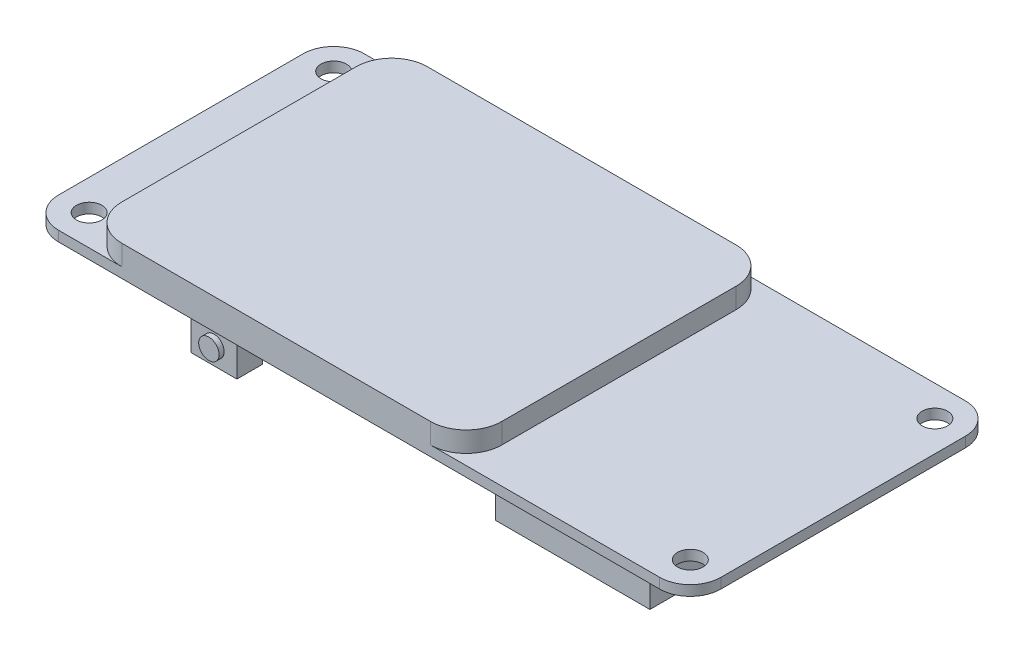
ISO-10303-21;
HEADER;
FILE_DESCRIPTION(('STEP AP214'),'2;1');
FILE_NAME('part.step','',(''),(''),'','','');
FILE_SCHEMA(('AUTOMOTIVE_DESIGN { 1 0 10303 214 1 1 1 1 }'));
ENDSEC;
DATA;
#1=APPLICATION_CONTEXT('core data for automotive mechanical design processes');
#2=APPLICATION_PROTOCOL_DEFINITION('international standard','automotive_design',2000,#1);
#3=PRODUCT_CONTEXT('',#1,'mechanical');
#4=PRODUCT('Part','Part','',(#3));
#5=PRODUCT_RELATED_PRODUCT_CATEGORY('part','',(#4));
#6=PRODUCT_DEFINITION_FORMATION('','',#4);
#7=PRODUCT_DEFINITION_CONTEXT('part definition',#1,'design');
#8=PRODUCT_DEFINITION('design','',#6,#7);
#9=PRODUCT_DEFINITION_SHAPE('','',#8);
#10=(LENGTH_UNIT() NAMED_UNIT(*) SI_UNIT(.MILLI.,.METRE.));
#11=(NAMED_UNIT(*) PLANE_ANGLE_UNIT() SI_UNIT($,.RADIAN.));
#12=(NAMED_UNIT(*) SI_UNIT($,.STERADIAN.) SOLID_ANGLE_UNIT());
#13=UNCERTAINTY_MEASURE_WITH_UNIT(LENGTH_MEASURE(1.E-05),#10,'distance_accuracy_value','');
#14=(GEOMETRIC_REPRESENTATION_CONTEXT(3) GLOBAL_UNCERTAINTY_ASSIGNED_CONTEXT((#13)) GLOBAL_UNIT_ASSIGNED_CONTEXT((#10,
#11,#12)) REPRESENTATION_CONTEXT('',''));
#15=CARTESIAN_POINT('',(0.,0.,0.));
#16=DIRECTION('',(0.,0.,1.));
#17=DIRECTION('',(1.,0.,0.));
#18=AXIS2_PLACEMENT_3D('',#15,#16,#17);
#19=CARTESIAN_POINT('',(29.5,0.,12.));
#20=DIRECTION('',(0.,1.,0.));
#21=DIRECTION('',(0.,0.,1.));
#22=AXIS2_PLACEMENT_3D('',#19,#20,#21);
#23=PLANE('',#22);
#24=DIRECTION('',(0.,0.,-1.));
#25=VECTOR('',#24,1.);
#26=CARTESIAN_POINT('',(10.61,0.,12.216190628889));
#27=LINE('',#26,#25);
#28=CARTESIAN_POINT('',(10.61,0.,12.216190628889));
#29=VERTEX_POINT('',#28);
#30=CARTESIAN_POINT('',(10.61,0.,-7.78380937111097));
#31=VERTEX_POINT('',#30);
#32=EDGE_CURVE('E245',#29,#31,#27,.T.);
#33=ORIENTED_EDGE('',*,*,#32,.F.);
#34=DIRECTION('',(-1.,0.,0.));
#35=VECTOR('',#34,1.);
#36=CARTESIAN_POINT('',(10.61,0.,12.216190628889));
#37=LINE('',#36,#35);
#38=CARTESIAN_POINT('',(25.75,0.,12.216190628889));
#39=VERTEX_POINT('',#38);
#40=EDGE_CURVE('E258',#39,#29,#37,.T.);
#41=ORIENTED_EDGE('',*,*,#40,.F.);
#42=DIRECTION('',(0.,0.,1.));
#43=VECTOR('',#42,1.);
#44=CARTESIAN_POINT('',(25.75,0.,12.216190628889));
#45=LINE('',#44,#43);
#46=CARTESIAN_POINT('',(25.75,0.,-7.78380937111097));
#47=VERTEX_POINT('',#46);
#48=EDGE_CURVE('E267',#47,#39,#45,.T.);
#49=ORIENTED_EDGE('',*,*,#48,.F.);
#50=DIRECTION('',(1.,0.,0.));
#51=VECTOR('',#50,1.);
#52=CARTESIAN_POINT('',(10.61,0.,-7.78380937111097));
#53=LINE('',#52,#51);
#54=EDGE_CURVE('E248',#31,#47,#53,.T.);
#55=ORIENTED_EDGE('',*,*,#54,.F.);
#56=EDGE_LOOP('',(#33,#41,#49,#55));
#57=FACE_BOUND('',#56,.T.);
#58=CARTESIAN_POINT('',(29.5,0.,12.));
#59=DIRECTION('',(0.,1.,0.));
#60=DIRECTION('',(0.,0.,1.));
#61=AXIS2_PLACEMENT_3D('',#58,#59,#60);
#62=CIRCLE('',#61,1.25);
#63=CARTESIAN_POINT('',(29.5,0.,13.25));
#64=VERTEX_POINT('',#63);
#65=EDGE_CURVE('E330',#64,#64,#62,.T.);
#66=ORIENTED_EDGE('',*,*,#65,.T.);
#67=EDGE_LOOP('',(#66));
#68=FACE_BOUND('',#67,.T.);
#69=CARTESIAN_POINT('',(-29.5,0.,12.));
#70=DIRECTION('',(0.,1.,0.));
#71=DIRECTION('',(0.,0.,1.));
#72=AXIS2_PLACEMENT_3D('',#69,#70,#71);
#73=CIRCLE('',#72,1.25);
#74=CARTESIAN_POINT('',(-29.5,0.,13.25));
#75=VERTEX_POINT('',#74);
#76=EDGE_CURVE('E338',#75,#75,#73,.T.);
#77=ORIENTED_EDGE('',*,*,#76,.T.);
#78=EDGE_LOOP('',(#77));
#79=FACE_BOUND('',#78,.T.);
#80=CARTESIAN_POINT('',(29.5,0.,-12.));
#81=DIRECTION('',(0.,1.,0.));
#82=DIRECTION('',(0.,0.,1.));
#83=AXIS2_PLACEMENT_3D('',#80,#81,#82);
#84=CIRCLE('',#83,1.25);
#85=CARTESIAN_POINT('',(29.5,0.,-10.75));
#86=VERTEX_POINT('',#85);
#87=EDGE_CURVE('E344',#86,#86,#84,.T.);
#88=ORIENTED_EDGE('',*,*,#87,.T.);
#89=EDGE_LOOP('',(#88));
#90=FACE_BOUND('',#89,.T.);
#91=CARTESIAN_POINT('',(-29.5,0.,-12.));
#92=DIRECTION('',(0.,1.,0.));
#93=DIRECTION('',(0.,0.,1.));
#94=AXIS2_PLACEMENT_3D('',#91,#92,#93);
#95=CIRCLE('',#94,1.25);
#96=CARTESIAN_POINT('',(-29.5,0.,-10.75));
#97=VERTEX_POINT('',#96);
#98=EDGE_CURVE('E350',#97,#97,#95,.T.);
#99=ORIENTED_EDGE('',*,*,#98,.T.);
#100=EDGE_LOOP('',(#99));
#101=FACE_BOUND('',#100,.T.);
#102=CARTESIAN_POINT('',(29.5,0.,12.));
#103=DIRECTION('',(0.,1.,0.));
#104=DIRECTION('',(0.,0.,1.));
#105=AXIS2_PLACEMENT_3D('',#102,#103,#104);
#106=CIRCLE('',#105,3.);
#107=CARTESIAN_POINT('',(29.5,0.,15.));
#108=VERTEX_POINT('',#107);
#109=CARTESIAN_POINT('',(32.5,0.,12.));
#110=VERTEX_POINT('',#109);
#111=EDGE_CURVE('E356',#108,#110,#106,.T.);
#112=ORIENTED_EDGE('',*,*,#111,.F.);
#113=DIRECTION('',(1.,0.,0.));
#114=VECTOR('',#113,1.);
#115=CARTESIAN_POINT('',(-29.5,0.,15.));
#116=LINE('',#115,#114);
#117=CARTESIAN_POINT('',(-29.5,0.,15.));
#118=VERTEX_POINT('',#117);
#119=EDGE_CURVE('E363',#118,#108,#116,.T.);
#120=ORIENTED_EDGE('',*,*,#119,.F.);
#121=CARTESIAN_POINT('',(-29.5,0.,12.));
#122=DIRECTION('',(0.,1.,0.));
#123=DIRECTION('',(0.,0.,1.));
#124=AXIS2_PLACEMENT_3D('',#121,#122,#123);
#125=CIRCLE('',#124,3.);
#126=CARTESIAN_POINT('',(-32.5,0.,12.));
#127=VERTEX_POINT('',#126);
#128=EDGE_CURVE('E392',#127,#118,#125,.T.);
#129=ORIENTED_EDGE('',*,*,#128,.F.);
#130=DIRECTION('',(0.,0.,1.));
#131=VECTOR('',#130,1.);
#132=CARTESIAN_POINT('',(-32.5,0.,-12.));
#133=LINE('',#132,#131);
#134=CARTESIAN_POINT('',(-32.5,0.,-12.));
#135=VERTEX_POINT('',#134);
#136=EDGE_CURVE('E390',#135,#127,#133,.T.);
#137=ORIENTED_EDGE('',*,*,#136,.F.);
#138=CARTESIAN_POINT('',(-29.5,0.,-12.));
#139=DIRECTION('',(0.,1.,0.));
#140=DIRECTION('',(0.,0.,1.));
#141=AXIS2_PLACEMENT_3D('',#138,#139,#140);
#142=CIRCLE('',#141,3.);
#143=CARTESIAN_POINT('',(-29.5,0.,-15.));
#144=VERTEX_POINT('',#143);
#145=EDGE_CURVE('E388',#144,#135,#142,.T.);
#146=ORIENTED_EDGE('',*,*,#145,.F.);
#147=DIRECTION('',(-1.,0.,0.));
#148=VECTOR('',#147,1.);
#149=CARTESIAN_POINT('',(-29.5,0.,-15.));
#150=LINE('',#149,#148);
#151=CARTESIAN_POINT('',(29.5,0.,-15.));
#152=VERTEX_POINT('',#151);
#153=EDGE_CURVE('E386',#152,#144,#150,.T.);
#154=ORIENTED_EDGE('',*,*,#153,.F.);
#155=CARTESIAN_POINT('',(29.5,0.,-12.));
#156=DIRECTION('',(0.,1.,0.));
#157=DIRECTION('',(0.,0.,-1.));
#158=AXIS2_PLACEMENT_3D('',#155,#156,#157);
#159=CIRCLE('',#158,3.);
#160=CARTESIAN_POINT('',(32.5,0.,-12.));
#161=VERTEX_POINT('',#160);
#162=EDGE_CURVE('E384',#161,#152,#159,.T.);
#163=ORIENTED_EDGE('',*,*,#162,.F.);
#164=DIRECTION('',(0.,0.,-1.));
#165=VECTOR('',#164,1.);
#166=CARTESIAN_POINT('',(32.5,0.,-12.));
#167=LINE('',#166,#165);
#168=EDGE_CURVE('E382',#110,#161,#167,.T.);
#169=ORIENTED_EDGE('',*,*,#168,.F.);
#170=EDGE_LOOP('',(#112,#120,#129,#137,#146,#154,#163,#169));
#171=FACE_BOUND('',#170,.T.);
#172=DIRECTION('',(0.,0.,-1.));
#173=VECTOR('',#172,1.);
#174=CARTESIAN_POINT('',(-25.5,0.,-9.));
#175=LINE('',#174,#173);
#176=CARTESIAN_POINT('',(-25.5,0.,-9.));
#177=VERTEX_POINT('',#176);
#178=CARTESIAN_POINT('',(-25.5,0.,-14.));
#179=VERTEX_POINT('',#178);
#180=EDGE_CURVE('E283',#177,#179,#175,.T.);
#181=ORIENTED_EDGE('',*,*,#180,.F.);
#182=DIRECTION('',(-1.,0.,0.));
#183=VECTOR('',#182,1.);
#184=CARTESIAN_POINT('',(-25.5,0.,-9.));
#185=LINE('',#184,#183);
#186=CARTESIAN_POINT('',(25.5,0.,-9.));
#187=VERTEX_POINT('',#186);
#188=EDGE_CURVE('E288',#187,#177,#185,.T.);
#189=ORIENTED_EDGE('',*,*,#188,.F.);
#190=DIRECTION('',(0.,0.,1.));
#191=VECTOR('',#190,1.);
#192=CARTESIAN_POINT('',(25.5,0.,-9.));
#193=LINE('',#192,#191);
#194=CARTESIAN_POINT('',(25.5,0.,-14.));
#195=VERTEX_POINT('',#194);
#196=EDGE_CURVE('E300',#195,#187,#193,.T.);
#197=ORIENTED_EDGE('',*,*,#196,.F.);
#198=DIRECTION('',(1.,0.,0.));
#199=VECTOR('',#198,1.);
#200=CARTESIAN_POINT('',(-25.5,0.,-14.));
#201=LINE('',#200,#199);
#202=EDGE_CURVE('E297',#179,#195,#201,.T.);
#203=ORIENTED_EDGE('',*,*,#202,.F.);
#204=EDGE_LOOP('',(#181,#189,#197,#203));
#205=FACE_BOUND('',#204,.T.);
#206=DIRECTION('',(0.,0.,-1.));
#207=VECTOR('',#206,1.);
#208=CARTESIAN_POINT('',(-17.,0.,14.5));
#209=LINE('',#208,#207);
#210=CARTESIAN_POINT('',(-17.,0.,14.5));
#211=VERTEX_POINT('',#210);
#212=CARTESIAN_POINT('',(-17.,0.,12.));
#213=VERTEX_POINT('',#212);
#214=EDGE_CURVE('E244',#211,#213,#209,.T.);
#215=ORIENTED_EDGE('',*,*,#214,.F.);
#216=DIRECTION('',(-1.,0.,0.));
#217=VECTOR('',#216,1.);
#218=CARTESIAN_POINT('',(-17.,0.,14.5));
#219=LINE('',#218,#217);
#220=CARTESIAN_POINT('',(-12.5,0.,14.5));
#221=VERTEX_POINT('',#220);
#222=EDGE_CURVE('E241',#221,#211,#219,.T.);
#223=ORIENTED_EDGE('',*,*,#222,.F.);
#224=DIRECTION('',(0.,0.,1.));
#225=VECTOR('',#224,1.);
#226=CARTESIAN_POINT('',(-12.5,0.,14.5));
#227=LINE('',#226,#225);
#228=CARTESIAN_POINT('',(-12.5,0.,12.));
#229=VERTEX_POINT('',#228);
#230=EDGE_CURVE('E59',#229,#221,#227,.T.);
#231=ORIENTED_EDGE('',*,*,#230,.F.);
#232=DIRECTION('',(1.,0.,0.));
#233=VECTOR('',#232,1.);
#234=CARTESIAN_POINT('',(-17.,0.,12.));
#235=LINE('',#234,#233);
#236=EDGE_CURVE('E54',#213,#229,#235,.T.);
#237=ORIENTED_EDGE('',*,*,#236,.F.);
#238=EDGE_LOOP('',(#215,#223,#231,#237));
#239=FACE_BOUND('',#238,.T.);
#240=ADVANCED_FACE('F39',(#57,#68,#79,#90,#101,#171,#205,#239),#23,.F.);
#241=CARTESIAN_POINT('',(29.5,1.,12.));
#242=DIRECTION('',(0.,1.,0.));
#243=DIRECTION('',(0.,0.,1.));
#244=AXIS2_PLACEMENT_3D('',#241,#242,#243);
#245=PLANE('',#244);
#246=DIRECTION('',(0.,0.,1.));
#247=VECTOR('',#246,1.);
#248=CARTESIAN_POINT('',(-26.8,1.,-15.));
#249=LINE('',#248,#247);
#250=CARTESIAN_POINT('',(-26.8,1.,-11.5));
#251=VERTEX_POINT('',#250);
#252=CARTESIAN_POINT('',(-26.8,1.,11.5));
#253=VERTEX_POINT('',#252);
#254=EDGE_CURVE('E316',#251,#253,#249,.T.);
#255=ORIENTED_EDGE('',*,*,#254,.F.);
#256=CARTESIAN_POINT('',(-23.3,1.,-11.5));
#257=DIRECTION('',(0.,1.,0.));
#258=DIRECTION('',(0.,0.,1.));
#259=AXIS2_PLACEMENT_3D('',#256,#257,#258);
#260=CIRCLE('',#259,3.5);
#261=CARTESIAN_POINT('',(-23.3,1.,-15.));
#262=VERTEX_POINT('',#261);
#263=EDGE_CURVE('E446',#251,#262,#260,.F.);
#264=ORIENTED_EDGE('',*,*,#263,.T.);
#265=DIRECTION('',(-1.,0.,0.));
#266=VECTOR('',#265,1.);
#267=CARTESIAN_POINT('',(-29.5,1.,-15.));
#268=LINE('',#267,#266);
#269=CARTESIAN_POINT('',(-29.5,1.,-15.));
#270=VERTEX_POINT('',#269);
#271=EDGE_CURVE('E367',#262,#270,#268,.T.);
#272=ORIENTED_EDGE('',*,*,#271,.T.);
#273=CARTESIAN_POINT('',(-29.5,1.,-12.));
#274=DIRECTION('',(0.,1.,0.));
#275=DIRECTION('',(0.,0.,1.));
#276=AXIS2_PLACEMENT_3D('',#273,#274,#275);
#277=CIRCLE('',#276,3.);
#278=CARTESIAN_POINT('',(-32.5,1.,-12.));
#279=VERTEX_POINT('',#278);
#280=EDGE_CURVE('E370',#270,#279,#277,.T.);
#281=ORIENTED_EDGE('',*,*,#280,.T.);
#282=DIRECTION('',(0.,0.,1.));
#283=VECTOR('',#282,1.);
#284=CARTESIAN_POINT('',(-32.5,1.,-12.));
#285=LINE('',#284,#283);
#286=CARTESIAN_POINT('',(-32.5,1.,12.));
#287=VERTEX_POINT('',#286);
#288=EDGE_CURVE('E372',#279,#287,#285,.T.);
#289=ORIENTED_EDGE('',*,*,#288,.T.);
#290=CARTESIAN_POINT('',(-29.5,1.,12.));
#291=DIRECTION('',(0.,1.,0.));
#292=DIRECTION('',(0.,0.,1.));
#293=AXIS2_PLACEMENT_3D('',#290,#291,#292);
#294=CIRCLE('',#293,3.);
#295=CARTESIAN_POINT('',(-29.5,1.,15.));
#296=VERTEX_POINT('',#295);
#297=EDGE_CURVE('E374',#287,#296,#294,.T.);
#298=ORIENTED_EDGE('',*,*,#297,.T.);
#299=DIRECTION('',(1.,0.,0.));
#300=VECTOR('',#299,1.);
#301=CARTESIAN_POINT('',(-29.5,1.,15.));
#302=LINE('',#301,#300);
#303=CARTESIAN_POINT('',(-23.3,1.,15.));
#304=VERTEX_POINT('',#303);
#305=EDGE_CURVE('E377',#296,#304,#302,.T.);
#306=ORIENTED_EDGE('',*,*,#305,.T.);
#307=CARTESIAN_POINT('',(-23.3,1.,11.5));
#308=DIRECTION('',(0.,1.,0.));
#309=DIRECTION('',(0.,0.,1.));
#310=AXIS2_PLACEMENT_3D('',#307,#308,#309);
#311=CIRCLE('',#310,3.5);
#312=EDGE_CURVE('E47',#304,#253,#311,.F.);
#313=ORIENTED_EDGE('',*,*,#312,.T.);
#314=EDGE_LOOP('',(#255,#264,#272,#281,#289,#298,#306,#313));
#315=FACE_BOUND('',#314,.T.);
#316=CARTESIAN_POINT('',(-29.5,1.,-12.));
#317=DIRECTION('',(0.,1.,0.));
#318=DIRECTION('',(0.,0.,1.));
#319=AXIS2_PLACEMENT_3D('',#316,#317,#318);
#320=CIRCLE('',#319,1.25);
#321=CARTESIAN_POINT('',(-29.5,1.,-10.75));
#322=VERTEX_POINT('',#321);
#323=EDGE_CURVE('E353',#322,#322,#320,.T.);
#324=ORIENTED_EDGE('',*,*,#323,.F.);
#325=EDGE_LOOP('',(#324));
#326=FACE_BOUND('',#325,.T.);
#327=CARTESIAN_POINT('',(-29.5,1.,12.));
#328=DIRECTION('',(0.,1.,0.));
#329=DIRECTION('',(0.,0.,1.));
#330=AXIS2_PLACEMENT_3D('',#327,#328,#329);
#331=CIRCLE('',#330,1.25);
#332=CARTESIAN_POINT('',(-29.5,1.,13.25));
#333=VERTEX_POINT('',#332);
#334=EDGE_CURVE('E341',#333,#333,#331,.T.);
#335=ORIENTED_EDGE('',*,*,#334,.F.);
#336=EDGE_LOOP('',(#335));
#337=FACE_BOUND('',#336,.T.);
#338=ADVANCED_FACE('F456',(#315,#326,#337),#245,.T.);
#339=DIRECTION('',(0.,0.,-1.));
#340=VECTOR('',#339,1.);
#341=CARTESIAN_POINT('',(10.5,1.,-15.));
#342=LINE('',#341,#340);
#343=CARTESIAN_POINT('',(10.5,1.,11.5));
#344=VERTEX_POINT('',#343);
#345=CARTESIAN_POINT('',(10.5,1.,-11.5));
#346=VERTEX_POINT('',#345);
#347=EDGE_CURVE('E321',#344,#346,#342,.T.);
#348=ORIENTED_EDGE('',*,*,#347,.F.);
#349=CARTESIAN_POINT('',(7.00000000000001,1.,11.5));
#350=DIRECTION('',(0.,1.,0.));
#351=DIRECTION('',(0.,0.,1.));
#352=AXIS2_PLACEMENT_3D('',#349,#350,#351);
#353=CIRCLE('',#352,3.5);
#354=CARTESIAN_POINT('',(7.00000000000001,1.,15.));
#355=VERTEX_POINT('',#354);
#356=EDGE_CURVE('E451',#344,#355,#353,.F.);
#357=ORIENTED_EDGE('',*,*,#356,.T.);
#358=CARTESIAN_POINT('',(29.5,1.,15.));
#359=VERTEX_POINT('',#358);
#360=EDGE_CURVE('E376',#355,#359,#302,.T.);
#361=ORIENTED_EDGE('',*,*,#360,.T.);
#362=CARTESIAN_POINT('',(29.5,1.,12.));
#363=DIRECTION('',(0.,1.,0.));
#364=DIRECTION('',(0.,0.,1.));
#365=AXIS2_PLACEMENT_3D('',#362,#363,#364);
#366=CIRCLE('',#365,3.);
#367=CARTESIAN_POINT('',(32.5,1.,12.));
#368=VERTEX_POINT('',#367);
#369=EDGE_CURVE('E359',#359,#368,#366,.T.);
#370=ORIENTED_EDGE('',*,*,#369,.T.);
#371=DIRECTION('',(0.,0.,-1.));
#372=VECTOR('',#371,1.);
#373=CARTESIAN_POINT('',(32.5,1.,-12.));
#374=LINE('',#373,#372);
#375=CARTESIAN_POINT('',(32.5,1.,-12.));
#376=VERTEX_POINT('',#375);
#377=EDGE_CURVE('E362',#368,#376,#374,.T.);
#378=ORIENTED_EDGE('',*,*,#377,.T.);
#379=CARTESIAN_POINT('',(29.5,1.,-12.));
#380=DIRECTION('',(0.,1.,0.));
#381=DIRECTION('',(0.,0.,-1.));
#382=AXIS2_PLACEMENT_3D('',#379,#380,#381);
#383=CIRCLE('',#382,3.);
#384=CARTESIAN_POINT('',(29.5,1.,-15.));
#385=VERTEX_POINT('',#384);
#386=EDGE_CURVE('E365',#376,#385,#383,.T.);
#387=ORIENTED_EDGE('',*,*,#386,.T.);
#388=CARTESIAN_POINT('',(6.99999999999999,1.,-15.));
#389=VERTEX_POINT('',#388);
#390=EDGE_CURVE('E368',#385,#389,#268,.T.);
#391=ORIENTED_EDGE('',*,*,#390,.T.);
#392=CARTESIAN_POINT('',(7.,1.,-11.5));
#393=DIRECTION('',(0.,1.,0.));
#394=DIRECTION('',(0.,0.,1.));
#395=AXIS2_PLACEMENT_3D('',#392,#393,#394);
#396=CIRCLE('',#395,3.5);
#397=EDGE_CURVE('E449',#389,#346,#396,.F.);
#398=ORIENTED_EDGE('',*,*,#397,.T.);
#399=EDGE_LOOP('',(#348,#357,#361,#370,#378,#387,#391,#398));
#400=FACE_BOUND('',#399,.T.);
#401=CARTESIAN_POINT('',(29.5,1.,-12.));
#402=DIRECTION('',(0.,1.,0.));
#403=DIRECTION('',(0.,0.,1.));
#404=AXIS2_PLACEMENT_3D('',#401,#402,#403);
#405=CIRCLE('',#404,1.25);
#406=CARTESIAN_POINT('',(29.5,1.,-10.75));
#407=VERTEX_POINT('',#406);
#408=EDGE_CURVE('E347',#407,#407,#405,.T.);
#409=ORIENTED_EDGE('',*,*,#408,.F.);
#410=EDGE_LOOP('',(#409));
#411=FACE_BOUND('',#410,.T.);
#412=CARTESIAN_POINT('',(29.5,1.,12.));
#413=DIRECTION('',(0.,1.,0.));
#414=DIRECTION('',(0.,0.,1.));
#415=AXIS2_PLACEMENT_3D('',#412,#413,#414);
#416=CIRCLE('',#415,1.25);
#417=CARTESIAN_POINT('',(29.5,1.,13.25));
#418=VERTEX_POINT('',#417);
#419=EDGE_CURVE('E335',#418,#418,#416,.T.);
#420=ORIENTED_EDGE('',*,*,#419,.F.);
#421=EDGE_LOOP('',(#420));
#422=FACE_BOUND('',#421,.T.);
#423=ADVANCED_FACE('F523',(#400,#411,#422),#245,.T.);
#424=CARTESIAN_POINT('',(29.5,1.,12.));
#425=DIRECTION('',(0.,-1.,0.));
#426=DIRECTION('',(0.,0.,-1.));
#427=AXIS2_PLACEMENT_3D('',#424,#425,#426);
#428=CYLINDRICAL_SURFACE('',#427,3.);
#429=ORIENTED_EDGE('',*,*,#111,.T.);
#430=DIRECTION('',(0.,-1.,0.));
#431=VECTOR('',#430,1.);
#432=CARTESIAN_POINT('',(32.5,1.,12.));
#433=LINE('',#432,#431);
#434=EDGE_CURVE('E415',#368,#110,#433,.T.);
#435=ORIENTED_EDGE('',*,*,#434,.F.);
#436=ORIENTED_EDGE('',*,*,#369,.F.);
#437=DIRECTION('',(0.,-1.,0.));
#438=VECTOR('',#437,1.);
#439=CARTESIAN_POINT('',(29.5,1.,15.));
#440=LINE('',#439,#438);
#441=EDGE_CURVE('E379',#359,#108,#440,.T.);
#442=ORIENTED_EDGE('',*,*,#441,.T.);
#443=EDGE_LOOP('',(#429,#435,#436,#442));
#444=FACE_BOUND('',#443,.T.);
#445=ADVANCED_FACE('F520',(#444),#428,.T.);
#446=CARTESIAN_POINT('',(32.5,1.,-12.));
#447=DIRECTION('',(-1.,0.,0.));
#448=DIRECTION('',(0.,0.,1.));
#449=AXIS2_PLACEMENT_3D('',#446,#447,#448);
#450=PLANE('',#449);
#451=ORIENTED_EDGE('',*,*,#168,.T.);
#452=DIRECTION('',(0.,-1.,0.));
#453=VECTOR('',#452,1.);
#454=CARTESIAN_POINT('',(32.5,1.,-12.));
#455=LINE('',#454,#453);
#456=EDGE_CURVE('E412',#376,#161,#455,.T.);
#457=ORIENTED_EDGE('',*,*,#456,.F.);
#458=ORIENTED_EDGE('',*,*,#377,.F.);
#459=ORIENTED_EDGE('',*,*,#434,.T.);
#460=EDGE_LOOP('',(#451,#457,#458,#459));
#461=FACE_BOUND('',#460,.T.);
#462=ADVANCED_FACE('F531',(#461),#450,.F.);
#463=CARTESIAN_POINT('',(29.5,1.,-12.));
#464=DIRECTION('',(0.,-1.,0.));
#465=DIRECTION('',(0.,0.,-1.));
#466=AXIS2_PLACEMENT_3D('',#463,#464,#465);
#467=CYLINDRICAL_SURFACE('',#466,3.);
#468=ORIENTED_EDGE('',*,*,#162,.T.);
#469=DIRECTION('',(0.,-1.,0.));
#470=VECTOR('',#469,1.);
#471=CARTESIAN_POINT('',(29.5,1.,-15.));
#472=LINE('',#471,#470);
#473=EDGE_CURVE('E409',#385,#152,#472,.T.);
#474=ORIENTED_EDGE('',*,*,#473,.F.);
#475=ORIENTED_EDGE('',*,*,#386,.F.);
#476=ORIENTED_EDGE('',*,*,#456,.T.);
#477=EDGE_LOOP('',(#468,#474,#475,#476));
#478=FACE_BOUND('',#477,.T.);
#479=ADVANCED_FACE('F529',(#478),#467,.T.);
#480=CARTESIAN_POINT('',(-29.5,1.,-15.));
#481=DIRECTION('',(0.,0.,1.));
#482=DIRECTION('',(1.,0.,0.));
#483=AXIS2_PLACEMENT_3D('',#480,#481,#482);
#484=PLANE('',#483);
#485=ORIENTED_EDGE('',*,*,#271,.F.);
#486=DIRECTION('',(0.,-1.,0.));
#487=VECTOR('',#486,1.);
#488=CARTESIAN_POINT('',(-23.3,1.,-15.));
#489=LINE('',#488,#487);
#490=CARTESIAN_POINT('',(-23.3,3.,-15.));
#491=VERTEX_POINT('',#490);
#492=EDGE_CURVE('E426',#262,#491,#489,.F.);
#493=ORIENTED_EDGE('',*,*,#492,.T.);
#494=DIRECTION('',(-1.,0.,0.));
#495=VECTOR('',#494,1.);
#496=CARTESIAN_POINT('',(-26.8,3.,-15.));
#497=LINE('',#496,#495);
#498=CARTESIAN_POINT('',(7.,3.,-15.));
#499=VERTEX_POINT('',#498);
#500=EDGE_CURVE('E327',#499,#491,#497,.T.);
#501=ORIENTED_EDGE('',*,*,#500,.F.);
#502=DIRECTION('',(0.,-1.,0.));
#503=VECTOR('',#502,1.);
#504=CARTESIAN_POINT('',(7.,1.,-15.));
#505=LINE('',#504,#503);
#506=EDGE_CURVE('E423',#499,#389,#505,.T.);
#507=ORIENTED_EDGE('',*,*,#506,.T.);
#508=ORIENTED_EDGE('',*,*,#390,.F.);
#509=ORIENTED_EDGE('',*,*,#473,.T.);
#510=ORIENTED_EDGE('',*,*,#153,.T.);
#511=DIRECTION('',(0.,-1.,0.));
#512=VECTOR('',#511,1.);
#513=CARTESIAN_POINT('',(-29.5,1.,-15.));
#514=LINE('',#513,#512);
#515=EDGE_CURVE('E406',#270,#144,#514,.T.);
#516=ORIENTED_EDGE('',*,*,#515,.F.);
#517=EDGE_LOOP('',(#485,#493,#501,#507,#508,#509,#510,#516));
#518=FACE_BOUND('',#517,.T.);
#519=ADVANCED_FACE('F491',(#518),#484,.F.);
#520=CARTESIAN_POINT('',(-29.5,1.,-12.));
#521=DIRECTION('',(0.,-1.,0.));
#522=DIRECTION('',(0.,0.,-1.));
#523=AXIS2_PLACEMENT_3D('',#520,#521,#522);
#524=CYLINDRICAL_SURFACE('',#523,3.);
#525=ORIENTED_EDGE('',*,*,#145,.T.);
#526=DIRECTION('',(0.,-1.,0.));
#527=VECTOR('',#526,1.);
#528=CARTESIAN_POINT('',(-32.5,1.,-12.));
#529=LINE('',#528,#527);
#530=EDGE_CURVE('E403',#279,#135,#529,.T.);
#531=ORIENTED_EDGE('',*,*,#530,.F.);
#532=ORIENTED_EDGE('',*,*,#280,.F.);
#533=ORIENTED_EDGE('',*,*,#515,.T.);
#534=EDGE_LOOP('',(#525,#531,#532,#533));
#535=FACE_BOUND('',#534,.T.);
#536=ADVANCED_FACE('F502',(#535),#524,.T.);
#537=CARTESIAN_POINT('',(-32.5,1.,-12.));
#538=DIRECTION('',(1.,0.,0.));
#539=DIRECTION('',(0.,0.,-1.));
#540=AXIS2_PLACEMENT_3D('',#537,#538,#539);
#541=PLANE('',#540);
#542=ORIENTED_EDGE('',*,*,#136,.T.);
#543=DIRECTION('',(0.,-1.,0.));
#544=VECTOR('',#543,1.);
#545=CARTESIAN_POINT('',(-32.5,1.,12.));
#546=LINE('',#545,#544);
#547=EDGE_CURVE('E400',#287,#127,#546,.T.);
#548=ORIENTED_EDGE('',*,*,#547,.F.);
#549=ORIENTED_EDGE('',*,*,#288,.F.);
#550=ORIENTED_EDGE('',*,*,#530,.T.);
#551=EDGE_LOOP('',(#542,#548,#549,#550));
#552=FACE_BOUND('',#551,.T.);
#553=ADVANCED_FACE('F507',(#552),#541,.F.);
#554=CARTESIAN_POINT('',(-29.5,1.,12.));
#555=DIRECTION('',(0.,-1.,0.));
#556=DIRECTION('',(0.,0.,-1.));
#557=AXIS2_PLACEMENT_3D('',#554,#555,#556);
#558=CYLINDRICAL_SURFACE('',#557,3.);
#559=ORIENTED_EDGE('',*,*,#128,.T.);
#560=DIRECTION('',(0.,-1.,0.));
#561=VECTOR('',#560,1.);
#562=CARTESIAN_POINT('',(-29.5,1.,15.));
#563=LINE('',#562,#561);
#564=EDGE_CURVE('E397',#296,#118,#563,.T.);
#565=ORIENTED_EDGE('',*,*,#564,.F.);
#566=ORIENTED_EDGE('',*,*,#297,.F.);
#567=ORIENTED_EDGE('',*,*,#547,.T.);
#568=EDGE_LOOP('',(#559,#565,#566,#567));
#569=FACE_BOUND('',#568,.T.);
#570=ADVANCED_FACE('F511',(#569),#558,.T.);
#571=CARTESIAN_POINT('',(-29.5,1.,15.));
#572=DIRECTION('',(0.,0.,-1.));
#573=DIRECTION('',(-1.,0.,0.));
#574=AXIS2_PLACEMENT_3D('',#571,#572,#573);
#575=PLANE('',#574);
#576=ORIENTED_EDGE('',*,*,#360,.F.);
#577=DIRECTION('',(0.,-1.,0.));
#578=VECTOR('',#577,1.);
#579=CARTESIAN_POINT('',(7.00000000000001,1.,15.));
#580=LINE('',#579,#578);
#581=CARTESIAN_POINT('',(7.00000000000001,3.,15.));
#582=VERTEX_POINT('',#581);
#583=EDGE_CURVE('E444',#355,#582,#580,.F.);
#584=ORIENTED_EDGE('',*,*,#583,.T.);
#585=DIRECTION('',(1.,0.,0.));
#586=VECTOR('',#585,1.);
#587=CARTESIAN_POINT('',(-26.8,3.,15.));
#588=LINE('',#587,#586);
#589=CARTESIAN_POINT('',(-23.3,3.,15.));
#590=VERTEX_POINT('',#589);
#591=EDGE_CURVE('E320',#590,#582,#588,.T.);
#592=ORIENTED_EDGE('',*,*,#591,.F.);
#593=DIRECTION('',(0.,-1.,0.));
#594=VECTOR('',#593,1.);
#595=CARTESIAN_POINT('',(-23.3,1.,15.));
#596=LINE('',#595,#594);
#597=EDGE_CURVE('E441',#590,#304,#596,.T.);
#598=ORIENTED_EDGE('',*,*,#597,.T.);
#599=ORIENTED_EDGE('',*,*,#305,.F.);
#600=ORIENTED_EDGE('',*,*,#564,.T.);
#601=ORIENTED_EDGE('',*,*,#119,.T.);
#602=ORIENTED_EDGE('',*,*,#441,.F.);
#603=EDGE_LOOP('',(#576,#584,#592,#598,#599,#600,#601,#602));
#604=FACE_BOUND('',#603,.T.);
#605=ADVANCED_FACE('F472',(#604),#575,.F.);
#606=CARTESIAN_POINT('',(-29.5,1.,-12.));
#607=DIRECTION('',(0.,-1.,0.));
#608=DIRECTION('',(0.,0.,-1.));
#609=AXIS2_PLACEMENT_3D('',#606,#607,#608);
#610=CYLINDRICAL_SURFACE('',#609,1.25);
#611=ORIENTED_EDGE('',*,*,#323,.T.);
#612=EDGE_LOOP('',(#611));
#613=FACE_BOUND('',#612,.T.);
#614=ORIENTED_EDGE('',*,*,#98,.F.);
#615=EDGE_LOOP('',(#614));
#616=FACE_BOUND('',#615,.T.);
#617=ADVANCED_FACE('F552',(#613,#616),#610,.F.);
#618=CARTESIAN_POINT('',(29.5,1.,-12.));
#619=DIRECTION('',(0.,-1.,0.));
#620=DIRECTION('',(0.,0.,-1.));
#621=AXIS2_PLACEMENT_3D('',#618,#619,#620);
#622=CYLINDRICAL_SURFACE('',#621,1.25);
#623=ORIENTED_EDGE('',*,*,#408,.T.);
#624=EDGE_LOOP('',(#623));
#625=FACE_BOUND('',#624,.T.);
#626=ORIENTED_EDGE('',*,*,#87,.F.);
#627=EDGE_LOOP('',(#626));
#628=FACE_BOUND('',#627,.T.);
#629=ADVANCED_FACE('F588',(#625,#628),#622,.F.);
#630=CARTESIAN_POINT('',(-29.5,1.,12.));
#631=DIRECTION('',(0.,-1.,0.));
#632=DIRECTION('',(0.,0.,-1.));
#633=AXIS2_PLACEMENT_3D('',#630,#631,#632);
#634=CYLINDRICAL_SURFACE('',#633,1.25);
#635=ORIENTED_EDGE('',*,*,#334,.T.);
#636=EDGE_LOOP('',(#635));
#637=FACE_BOUND('',#636,.T.);
#638=ORIENTED_EDGE('',*,*,#76,.F.);
#639=EDGE_LOOP('',(#638));
#640=FACE_BOUND('',#639,.T.);
#641=ADVANCED_FACE('F595',(#637,#640),#634,.F.);
#642=CARTESIAN_POINT('',(29.5,1.,12.));
#643=DIRECTION('',(0.,-1.,0.));
#644=DIRECTION('',(0.,0.,-1.));
#645=AXIS2_PLACEMENT_3D('',#642,#643,#644);
#646=CYLINDRICAL_SURFACE('',#645,1.25);
#647=ORIENTED_EDGE('',*,*,#419,.T.);
#648=EDGE_LOOP('',(#647));
#649=FACE_BOUND('',#648,.T.);
#650=ORIENTED_EDGE('',*,*,#65,.F.);
#651=EDGE_LOOP('',(#650));
#652=FACE_BOUND('',#651,.T.);
#653=ADVANCED_FACE('F603',(#649,#652),#646,.F.);
#654=CARTESIAN_POINT('',(-26.8,3.,-15.));
#655=DIRECTION('',(1.,0.,0.));
#656=DIRECTION('',(0.,0.,-1.));
#657=AXIS2_PLACEMENT_3D('',#654,#655,#656);
#658=PLANE('',#657);
#659=DIRECTION('',(0.,0.,1.));
#660=VECTOR('',#659,1.);
#661=CARTESIAN_POINT('',(-26.8,3.,-15.));
#662=LINE('',#661,#660);
#663=CARTESIAN_POINT('',(-26.8,3.,-11.5));
#664=VERTEX_POINT('',#663);
#665=CARTESIAN_POINT('',(-26.8,3.,11.5));
#666=VERTEX_POINT('',#665);
#667=EDGE_CURVE('E317',#664,#666,#662,.T.);
#668=ORIENTED_EDGE('',*,*,#667,.F.);
#669=DIRECTION('',(0.,-1.,0.));
#670=VECTOR('',#669,1.);
#671=CARTESIAN_POINT('',(-26.8,3.,-11.5));
#672=LINE('',#671,#670);
#673=EDGE_CURVE('E420',#664,#251,#672,.T.);
#674=ORIENTED_EDGE('',*,*,#673,.T.);
#675=ORIENTED_EDGE('',*,*,#254,.T.);
#676=DIRECTION('',(0.,-1.,0.));
#677=VECTOR('',#676,1.);
#678=CARTESIAN_POINT('',(-26.8,3.,11.5));
#679=LINE('',#678,#677);
#680=EDGE_CURVE('E418',#253,#666,#679,.F.);
#681=ORIENTED_EDGE('',*,*,#680,.T.);
#682=EDGE_LOOP('',(#668,#674,#675,#681));
#683=FACE_BOUND('',#682,.T.);
#684=ADVANCED_FACE('F464',(#683),#658,.F.);
#685=CARTESIAN_POINT('',(10.5,3.,-15.));
#686=DIRECTION('',(-1.,0.,0.));
#687=DIRECTION('',(0.,0.,1.));
#688=AXIS2_PLACEMENT_3D('',#685,#686,#687);
#689=PLANE('',#688);
#690=ORIENTED_EDGE('',*,*,#347,.T.);
#691=DIRECTION('',(0.,-1.,0.));
#692=VECTOR('',#691,1.);
#693=CARTESIAN_POINT('',(10.5,3.,-11.5));
#694=LINE('',#693,#692);
#695=CARTESIAN_POINT('',(10.5,3.,-11.5));
#696=VERTEX_POINT('',#695);
#697=EDGE_CURVE('E439',#346,#696,#694,.F.);
#698=ORIENTED_EDGE('',*,*,#697,.T.);
#699=DIRECTION('',(0.,0.,-1.));
#700=VECTOR('',#699,1.);
#701=CARTESIAN_POINT('',(10.5,3.,-15.));
#702=LINE('',#701,#700);
#703=CARTESIAN_POINT('',(10.5,3.,11.5));
#704=VERTEX_POINT('',#703);
#705=EDGE_CURVE('E324',#704,#696,#702,.T.);
#706=ORIENTED_EDGE('',*,*,#705,.F.);
#707=DIRECTION('',(0.,-1.,0.));
#708=VECTOR('',#707,1.);
#709=CARTESIAN_POINT('',(10.5,3.,11.5));
#710=LINE('',#709,#708);
#711=EDGE_CURVE('E436',#704,#344,#710,.T.);
#712=ORIENTED_EDGE('',*,*,#711,.T.);
#713=EDGE_LOOP('',(#690,#698,#706,#712));
#714=FACE_BOUND('',#713,.T.);
#715=ADVANCED_FACE('F481',(#714),#689,.F.);
#716=CARTESIAN_POINT('',(0.,3.,0.));
#717=DIRECTION('',(0.,1.,0.));
#718=DIRECTION('',(0.,0.,1.));
#719=AXIS2_PLACEMENT_3D('',#716,#717,#718);
#720=PLANE('',#719);
#721=ORIENTED_EDGE('',*,*,#500,.T.);
#722=CARTESIAN_POINT('',(-23.3,3.,-11.5));
#723=DIRECTION('',(0.,1.,0.));
#724=DIRECTION('',(0.,0.,1.));
#725=AXIS2_PLACEMENT_3D('',#722,#723,#724);
#726=CIRCLE('',#725,3.5);
#727=EDGE_CURVE('E434',#491,#664,#726,.T.);
#728=ORIENTED_EDGE('',*,*,#727,.T.);
#729=ORIENTED_EDGE('',*,*,#667,.T.);
#730=CARTESIAN_POINT('',(-23.3,3.,11.5));
#731=DIRECTION('',(0.,1.,0.));
#732=DIRECTION('',(0.,0.,1.));
#733=AXIS2_PLACEMENT_3D('',#730,#731,#732);
#734=CIRCLE('',#733,3.5);
#735=EDGE_CURVE('E428',#666,#590,#734,.T.);
#736=ORIENTED_EDGE('',*,*,#735,.T.);
#737=ORIENTED_EDGE('',*,*,#591,.T.);
#738=CARTESIAN_POINT('',(7.00000000000001,3.,11.5));
#739=DIRECTION('',(0.,1.,0.));
#740=DIRECTION('',(0.,0.,1.));
#741=AXIS2_PLACEMENT_3D('',#738,#739,#740);
#742=CIRCLE('',#741,3.5);
#743=EDGE_CURVE('E430',#582,#704,#742,.T.);
#744=ORIENTED_EDGE('',*,*,#743,.T.);
#745=ORIENTED_EDGE('',*,*,#705,.T.);
#746=CARTESIAN_POINT('',(7.,3.,-11.5));
#747=DIRECTION('',(0.,1.,0.));
#748=DIRECTION('',(0.,0.,1.));
#749=AXIS2_PLACEMENT_3D('',#746,#747,#748);
#750=CIRCLE('',#749,3.5);
#751=EDGE_CURVE('E432',#696,#499,#750,.T.);
#752=ORIENTED_EDGE('',*,*,#751,.T.);
#753=EDGE_LOOP('',(#721,#728,#729,#736,#737,#744,#745,#752));
#754=FACE_BOUND('',#753,.T.);
#755=ADVANCED_FACE('F469',(#754),#720,.T.);
#756=CARTESIAN_POINT('',(-23.3,3.,-11.5));
#757=DIRECTION('',(0.,-1.,0.));
#758=DIRECTION('',(0.,0.,-1.));
#759=AXIS2_PLACEMENT_3D('',#756,#757,#758);
#760=CYLINDRICAL_SURFACE('',#759,3.5);
#761=ORIENTED_EDGE('',*,*,#727,.F.);
#762=ORIENTED_EDGE('',*,*,#492,.F.);
#763=ORIENTED_EDGE('',*,*,#263,.F.);
#764=ORIENTED_EDGE('',*,*,#673,.F.);
#765=EDGE_LOOP('',(#761,#762,#763,#764));
#766=FACE_BOUND('',#765,.T.);
#767=ADVANCED_FACE('F496',(#766),#760,.T.);
#768=CARTESIAN_POINT('',(7.,1.,-11.5));
#769=DIRECTION('',(0.,-1.,0.));
#770=DIRECTION('',(0.,0.,-1.));
#771=AXIS2_PLACEMENT_3D('',#768,#769,#770);
#772=CYLINDRICAL_SURFACE('',#771,3.5);
#773=ORIENTED_EDGE('',*,*,#751,.F.);
#774=ORIENTED_EDGE('',*,*,#697,.F.);
#775=ORIENTED_EDGE('',*,*,#397,.F.);
#776=ORIENTED_EDGE('',*,*,#506,.F.);
#777=EDGE_LOOP('',(#773,#774,#775,#776));
#778=FACE_BOUND('',#777,.T.);
#779=ADVANCED_FACE('F486',(#778),#772,.T.);
#780=CARTESIAN_POINT('',(7.00000000000001,3.,11.5));
#781=DIRECTION('',(0.,-1.,0.));
#782=DIRECTION('',(0.,0.,-1.));
#783=AXIS2_PLACEMENT_3D('',#780,#781,#782);
#784=CYLINDRICAL_SURFACE('',#783,3.5);
#785=ORIENTED_EDGE('',*,*,#743,.F.);
#786=ORIENTED_EDGE('',*,*,#583,.F.);
#787=ORIENTED_EDGE('',*,*,#356,.F.);
#788=ORIENTED_EDGE('',*,*,#711,.F.);
#789=EDGE_LOOP('',(#785,#786,#787,#788));
#790=FACE_BOUND('',#789,.T.);
#791=ADVANCED_FACE('F476',(#790),#784,.T.);
#792=CARTESIAN_POINT('',(-23.3,1.,11.5));
#793=DIRECTION('',(0.,-1.,0.));
#794=DIRECTION('',(0.,0.,-1.));
#795=AXIS2_PLACEMENT_3D('',#792,#793,#794);
#796=CYLINDRICAL_SURFACE('',#795,3.5);
#797=ORIENTED_EDGE('',*,*,#735,.F.);
#798=ORIENTED_EDGE('',*,*,#680,.F.);
#799=ORIENTED_EDGE('',*,*,#312,.F.);
#800=ORIENTED_EDGE('',*,*,#597,.F.);
#801=EDGE_LOOP('',(#797,#798,#799,#800));
#802=FACE_BOUND('',#801,.T.);
#803=ADVANCED_FACE('F41',(#802),#796,.T.);
#804=CARTESIAN_POINT('',(-25.5,-7.,-9.));
#805=DIRECTION('',(1.,0.,0.));
#806=DIRECTION('',(0.,0.,-1.));
#807=AXIS2_PLACEMENT_3D('',#804,#805,#806);
#808=PLANE('',#807);
#809=ORIENTED_EDGE('',*,*,#180,.T.);
#810=DIRECTION('',(0.,1.,0.));
#811=VECTOR('',#810,1.);
#812=CARTESIAN_POINT('',(-25.5,-7.,-14.));
#813=LINE('',#812,#811);
#814=CARTESIAN_POINT('',(-25.5,-7.,-14.));
#815=VERTEX_POINT('',#814);
#816=EDGE_CURVE('E313',#815,#179,#813,.T.);
#817=ORIENTED_EDGE('',*,*,#816,.F.);
#818=DIRECTION('',(0.,0.,-1.));
#819=VECTOR('',#818,1.);
#820=CARTESIAN_POINT('',(-25.5,-7.,-9.));
#821=LINE('',#820,#819);
#822=CARTESIAN_POINT('',(-25.5,-7.,-9.));
#823=VERTEX_POINT('',#822);
#824=EDGE_CURVE('E284',#823,#815,#821,.T.);
#825=ORIENTED_EDGE('',*,*,#824,.F.);
#826=DIRECTION('',(0.,1.,0.));
#827=VECTOR('',#826,1.);
#828=CARTESIAN_POINT('',(-25.5,-7.,-9.));
#829=LINE('',#828,#827);
#830=EDGE_CURVE('E294',#823,#177,#829,.T.);
#831=ORIENTED_EDGE('',*,*,#830,.T.);
#832=EDGE_LOOP('',(#809,#817,#825,#831));
#833=FACE_BOUND('',#832,.T.);
#834=ADVANCED_FACE('F653',(#833),#808,.F.);
#835=CARTESIAN_POINT('',(-25.5,-7.,-14.));
#836=DIRECTION('',(0.,0.,1.));
#837=DIRECTION('',(1.,0.,0.));
#838=AXIS2_PLACEMENT_3D('',#835,#836,#837);
#839=PLANE('',#838);
#840=ORIENTED_EDGE('',*,*,#202,.T.);
#841=DIRECTION('',(0.,1.,0.));
#842=VECTOR('',#841,1.);
#843=CARTESIAN_POINT('',(25.5,-7.,-14.));
#844=LINE('',#843,#842);
#845=CARTESIAN_POINT('',(25.5,-7.,-14.));
#846=VERTEX_POINT('',#845);
#847=EDGE_CURVE('E310',#846,#195,#844,.T.);
#848=ORIENTED_EDGE('',*,*,#847,.F.);
#849=DIRECTION('',(1.,0.,0.));
#850=VECTOR('',#849,1.);
#851=CARTESIAN_POINT('',(-25.5,-7.,-14.));
#852=LINE('',#851,#850);
#853=EDGE_CURVE('E287',#815,#846,#852,.T.);
#854=ORIENTED_EDGE('',*,*,#853,.F.);
#855=ORIENTED_EDGE('',*,*,#816,.T.);
#856=EDGE_LOOP('',(#840,#848,#854,#855));
#857=FACE_BOUND('',#856,.T.);
#858=ADVANCED_FACE('F659',(#857),#839,.F.);
#859=CARTESIAN_POINT('',(25.5,-7.,-9.));
#860=DIRECTION('',(-1.,0.,0.));
#861=DIRECTION('',(0.,0.,1.));
#862=AXIS2_PLACEMENT_3D('',#859,#860,#861);
#863=PLANE('',#862);
#864=ORIENTED_EDGE('',*,*,#196,.T.);
#865=DIRECTION('',(0.,1.,0.));
#866=VECTOR('',#865,1.);
#867=CARTESIAN_POINT('',(25.5,-7.,-9.));
#868=LINE('',#867,#866);
#869=CARTESIAN_POINT('',(25.5,-7.,-9.));
#870=VERTEX_POINT('',#869);
#871=EDGE_CURVE('E307',#870,#187,#868,.T.);
#872=ORIENTED_EDGE('',*,*,#871,.F.);
#873=DIRECTION('',(0.,0.,1.));
#874=VECTOR('',#873,1.);
#875=CARTESIAN_POINT('',(25.5,-7.,-9.));
#876=LINE('',#875,#874);
#877=EDGE_CURVE('E290',#846,#870,#876,.T.);
#878=ORIENTED_EDGE('',*,*,#877,.F.);
#879=ORIENTED_EDGE('',*,*,#847,.T.);
#880=EDGE_LOOP('',(#864,#872,#878,#879));
#881=FACE_BOUND('',#880,.T.);
#882=ADVANCED_FACE('F667',(#881),#863,.F.);
#883=CARTESIAN_POINT('',(-25.5,-7.,-9.));
#884=DIRECTION('',(0.,0.,-1.));
#885=DIRECTION('',(-1.,0.,0.));
#886=AXIS2_PLACEMENT_3D('',#883,#884,#885);
#887=PLANE('',#886);
#888=ORIENTED_EDGE('',*,*,#188,.T.);
#889=ORIENTED_EDGE('',*,*,#830,.F.);
#890=DIRECTION('',(-1.,0.,0.));
#891=VECTOR('',#890,1.);
#892=CARTESIAN_POINT('',(-25.5,-7.,-9.));
#893=LINE('',#892,#891);
#894=EDGE_CURVE('E292',#870,#823,#893,.T.);
#895=ORIENTED_EDGE('',*,*,#894,.F.);
#896=ORIENTED_EDGE('',*,*,#871,.T.);
#897=EDGE_LOOP('',(#888,#889,#895,#896));
#898=FACE_BOUND('',#897,.T.);
#899=ADVANCED_FACE('F675',(#898),#887,.F.);
#900=CARTESIAN_POINT('',(0.,-7.,0.));
#901=DIRECTION('',(0.,-1.,0.));
#902=DIRECTION('',(0.,0.,-1.));
#903=AXIS2_PLACEMENT_3D('',#900,#901,#902);
#904=PLANE('',#903);
#905=ORIENTED_EDGE('',*,*,#824,.T.);
#906=ORIENTED_EDGE('',*,*,#853,.T.);
#907=ORIENTED_EDGE('',*,*,#877,.T.);
#908=ORIENTED_EDGE('',*,*,#894,.T.);
#909=EDGE_LOOP('',(#905,#906,#907,#908));
#910=FACE_BOUND('',#909,.T.);
#911=ADVANCED_FACE('F683',(#910),#904,.T.);
#912=CARTESIAN_POINT('',(10.61,-5.,12.216190628889));
#913=DIRECTION('',(1.,0.,0.));
#914=DIRECTION('',(0.,0.,-1.));
#915=AXIS2_PLACEMENT_3D('',#912,#913,#914);
#916=PLANE('',#915);
#917=ORIENTED_EDGE('',*,*,#32,.T.);
#918=DIRECTION('',(0.,1.,0.));
#919=VECTOR('',#918,1.);
#920=CARTESIAN_POINT('',(10.61,-5.,-7.78380937111097));
#921=LINE('',#920,#919);
#922=CARTESIAN_POINT('',(10.61,-5.,-7.78380937111097));
#923=VERTEX_POINT('',#922);
#924=EDGE_CURVE('E280',#923,#31,#921,.T.);
#925=ORIENTED_EDGE('',*,*,#924,.F.);
#926=DIRECTION('',(0.,0.,-1.));
#927=VECTOR('',#926,1.);
#928=CARTESIAN_POINT('',(10.61,-5.,12.216190628889));
#929=LINE('',#928,#927);
#930=CARTESIAN_POINT('',(10.61,-5.,12.216190628889));
#931=VERTEX_POINT('',#930);
#932=EDGE_CURVE('E254',#931,#923,#929,.T.);
#933=ORIENTED_EDGE('',*,*,#932,.F.);
#934=DIRECTION('',(0.,1.,0.));
#935=VECTOR('',#934,1.);
#936=CARTESIAN_POINT('',(10.61,-5.,12.216190628889));
#937=LINE('',#936,#935);
#938=EDGE_CURVE('E263',#931,#29,#937,.T.);
#939=ORIENTED_EDGE('',*,*,#938,.T.);
#940=EDGE_LOOP('',(#917,#925,#933,#939));
#941=FACE_BOUND('',#940,.T.);
#942=ADVANCED_FACE('F691',(#941),#916,.F.);
#943=CARTESIAN_POINT('',(10.61,-5.,-7.78380937111097));
#944=DIRECTION('',(0.,0.,1.));
#945=DIRECTION('',(1.,0.,0.));
#946=AXIS2_PLACEMENT_3D('',#943,#944,#945);
#947=PLANE('',#946);
#948=ORIENTED_EDGE('',*,*,#54,.T.);
#949=DIRECTION('',(0.,1.,0.));
#950=VECTOR('',#949,1.);
#951=CARTESIAN_POINT('',(25.75,-5.,-7.78380937111097));
#952=LINE('',#951,#950);
#953=CARTESIAN_POINT('',(25.75,-5.,-7.78380937111097));
#954=VERTEX_POINT('',#953);
#955=EDGE_CURVE('E277',#954,#47,#952,.T.);
#956=ORIENTED_EDGE('',*,*,#955,.F.);
#957=DIRECTION('',(1.,0.,0.));
#958=VECTOR('',#957,1.);
#959=CARTESIAN_POINT('',(10.61,-5.,-7.78380937111097));
#960=LINE('',#959,#958);
#961=EDGE_CURVE('E257',#923,#954,#960,.T.);
#962=ORIENTED_EDGE('',*,*,#961,.F.);
#963=ORIENTED_EDGE('',*,*,#924,.T.);
#964=EDGE_LOOP('',(#948,#956,#962,#963));
#965=FACE_BOUND('',#964,.T.);
#966=ADVANCED_FACE('F699',(#965),#947,.F.);
#967=CARTESIAN_POINT('',(25.75,-5.,12.216190628889));
#968=DIRECTION('',(-1.,0.,0.));
#969=DIRECTION('',(0.,0.,1.));
#970=AXIS2_PLACEMENT_3D('',#967,#968,#969);
#971=PLANE('',#970);
#972=ORIENTED_EDGE('',*,*,#48,.T.);
#973=DIRECTION('',(0.,1.,0.));
#974=VECTOR('',#973,1.);
#975=CARTESIAN_POINT('',(25.75,-5.,12.216190628889));
#976=LINE('',#975,#974);
#977=CARTESIAN_POINT('',(25.75,-5.,12.216190628889));
#978=VERTEX_POINT('',#977);
#979=EDGE_CURVE('E274',#978,#39,#976,.T.);
#980=ORIENTED_EDGE('',*,*,#979,.F.);
#981=DIRECTION('',(0.,0.,1.));
#982=VECTOR('',#981,1.);
#983=CARTESIAN_POINT('',(25.75,-5.,12.216190628889));
#984=LINE('',#983,#982);
#985=EDGE_CURVE('E260',#954,#978,#984,.T.);
#986=ORIENTED_EDGE('',*,*,#985,.F.);
#987=ORIENTED_EDGE('',*,*,#955,.T.);
#988=EDGE_LOOP('',(#972,#980,#986,#987));
#989=FACE_BOUND('',#988,.T.);
#990=ADVANCED_FACE('F707',(#989),#971,.F.);
#991=CARTESIAN_POINT('',(10.61,-5.,12.216190628889));
#992=DIRECTION('',(0.,0.,-1.));
#993=DIRECTION('',(-1.,0.,0.));
#994=AXIS2_PLACEMENT_3D('',#991,#992,#993);
#995=PLANE('',#994);
#996=ORIENTED_EDGE('',*,*,#40,.T.);
#997=ORIENTED_EDGE('',*,*,#938,.F.);
#998=DIRECTION('',(-1.,0.,0.));
#999=VECTOR('',#998,1.);
#1000=CARTESIAN_POINT('',(10.61,-5.,12.216190628889));
#1001=LINE('',#1000,#999);
#1002=EDGE_CURVE('E262',#978,#931,#1001,.T.);
#1003=ORIENTED_EDGE('',*,*,#1002,.F.);
#1004=ORIENTED_EDGE('',*,*,#979,.T.);
#1005=EDGE_LOOP('',(#996,#997,#1003,#1004));
#1006=FACE_BOUND('',#1005,.T.);
#1007=ADVANCED_FACE('F715',(#1006),#995,.F.);
#1008=CARTESIAN_POINT('',(0.,-5.,0.));
#1009=DIRECTION('',(0.,-1.,0.));
#1010=DIRECTION('',(0.,0.,-1.));
#1011=AXIS2_PLACEMENT_3D('',#1008,#1009,#1010);
#1012=PLANE('',#1011);
#1013=ORIENTED_EDGE('',*,*,#932,.T.);
#1014=ORIENTED_EDGE('',*,*,#961,.T.);
#1015=ORIENTED_EDGE('',*,*,#985,.T.);
#1016=ORIENTED_EDGE('',*,*,#1002,.T.);
#1017=EDGE_LOOP('',(#1013,#1014,#1015,#1016));
#1018=FACE_BOUND('',#1017,.T.);
#1019=ADVANCED_FACE('F723',(#1018),#1012,.T.);
#1020=CARTESIAN_POINT('',(-17.,-3.4,14.5));
#1021=DIRECTION('',(1.,0.,0.));
#1022=DIRECTION('',(0.,0.,-1.));
#1023=AXIS2_PLACEMENT_3D('',#1020,#1021,#1022);
#1024=PLANE('',#1023);
#1025=ORIENTED_EDGE('',*,*,#214,.T.);
#1026=DIRECTION('',(0.,1.,0.));
#1027=VECTOR('',#1026,1.);
#1028=CARTESIAN_POINT('',(-17.,-3.4,12.));
#1029=LINE('',#1028,#1027);
#1030=CARTESIAN_POINT('',(-17.,-3.4,12.));
#1031=VERTEX_POINT('',#1030);
#1032=EDGE_CURVE('E225',#1031,#213,#1029,.T.);
#1033=ORIENTED_EDGE('',*,*,#1032,.F.);
#1034=DIRECTION('',(0.,0.,-1.));
#1035=VECTOR('',#1034,1.);
#1036=CARTESIAN_POINT('',(-17.,-3.4,14.5));
#1037=LINE('',#1036,#1035);
#1038=CARTESIAN_POINT('',(-17.,-3.4,14.5));
#1039=VERTEX_POINT('',#1038);
#1040=EDGE_CURVE('E232',#1039,#1031,#1037,.T.);
#1041=ORIENTED_EDGE('',*,*,#1040,.F.);
#1042=DIRECTION('',(0.,1.,0.));
#1043=VECTOR('',#1042,1.);
#1044=CARTESIAN_POINT('',(-17.,-3.4,14.5));
#1045=LINE('',#1044,#1043);
#1046=EDGE_CURVE('E970',#1039,#211,#1045,.T.);
#1047=ORIENTED_EDGE('',*,*,#1046,.T.);
#1048=EDGE_LOOP('',(#1025,#1033,#1041,#1047));
#1049=FACE_BOUND('',#1048,.T.);
#1050=ADVANCED_FACE('F243',(#1049),#1024,.F.);
#1051=CARTESIAN_POINT('',(-17.,-3.4,12.));
#1052=DIRECTION('',(0.,0.,1.));
#1053=DIRECTION('',(1.,0.,0.));
#1054=AXIS2_PLACEMENT_3D('',#1051,#1052,#1053);
#1055=PLANE('',#1054);
#1056=ORIENTED_EDGE('',*,*,#236,.T.);
#1057=DIRECTION('',(0.,1.,0.));
#1058=VECTOR('',#1057,1.);
#1059=CARTESIAN_POINT('',(-12.5,-3.4,12.));
#1060=LINE('',#1059,#1058);
#1061=CARTESIAN_POINT('',(-12.5,-3.4,12.));
#1062=VERTEX_POINT('',#1061);
#1063=EDGE_CURVE('E228',#1062,#229,#1060,.T.);
#1064=ORIENTED_EDGE('',*,*,#1063,.F.);
#1065=DIRECTION('',(1.,0.,0.));
#1066=VECTOR('',#1065,1.);
#1067=CARTESIAN_POINT('',(-17.,-3.4,12.));
#1068=LINE('',#1067,#1066);
#1069=EDGE_CURVE('E221',#1031,#1062,#1068,.T.);
#1070=ORIENTED_EDGE('',*,*,#1069,.F.);
#1071=ORIENTED_EDGE('',*,*,#1032,.T.);
#1072=EDGE_LOOP('',(#1056,#1064,#1070,#1071));
#1073=FACE_BOUND('',#1072,.T.);
#1074=ADVANCED_FACE('F223',(#1073),#1055,.F.);
#1075=CARTESIAN_POINT('',(-12.5,-3.4,14.5));
#1076=DIRECTION('',(-1.,0.,0.));
#1077=DIRECTION('',(0.,0.,1.));
#1078=AXIS2_PLACEMENT_3D('',#1075,#1076,#1077);
#1079=PLANE('',#1078);
#1080=ORIENTED_EDGE('',*,*,#230,.T.);
#1081=DIRECTION('',(0.,1.,0.));
#1082=VECTOR('',#1081,1.);
#1083=CARTESIAN_POINT('',(-12.5,-3.4,14.5));
#1084=LINE('',#1083,#1082);
#1085=CARTESIAN_POINT('',(-12.5,-3.4,14.5));
#1086=VERTEX_POINT('',#1085);
#1087=EDGE_CURVE('E250',#1086,#221,#1084,.T.);
#1088=ORIENTED_EDGE('',*,*,#1087,.F.);
#1089=DIRECTION('',(0.,0.,1.));
#1090=VECTOR('',#1089,1.);
#1091=CARTESIAN_POINT('',(-12.5,-3.4,14.5));
#1092=LINE('',#1091,#1090);
#1093=EDGE_CURVE('E231',#1062,#1086,#1092,.T.);
#1094=ORIENTED_EDGE('',*,*,#1093,.F.);
#1095=ORIENTED_EDGE('',*,*,#1063,.T.);
#1096=EDGE_LOOP('',(#1080,#1088,#1094,#1095));
#1097=FACE_BOUND('',#1096,.T.);
#1098=ADVANCED_FACE('F744',(#1097),#1079,.F.);
#1099=CARTESIAN_POINT('',(-17.,-3.4,14.5));
#1100=DIRECTION('',(0.,0.,-1.));
#1101=DIRECTION('',(-1.,0.,0.));
#1102=AXIS2_PLACEMENT_3D('',#1099,#1100,#1101);
#1103=PLANE('',#1102);
#1104=CARTESIAN_POINT('',(-14.75,-1.7,14.5));
#1105=DIRECTION('',(0.,0.,-1.));
#1106=DIRECTION('',(-1.,0.,0.));
#1107=AXIS2_PLACEMENT_3D('',#1104,#1105,#1106);
#1108=CIRCLE('',#1107,1.);
#1109=CARTESIAN_POINT('',(-15.75,-1.7,14.5));
#1110=VERTEX_POINT('',#1109);
#1111=EDGE_CURVE('E11',#1110,#1110,#1108,.F.);
#1112=ORIENTED_EDGE('',*,*,#1111,.F.);
#1113=EDGE_LOOP('',(#1112));
#1114=FACE_BOUND('',#1113,.T.);
#1115=ORIENTED_EDGE('',*,*,#222,.T.);
#1116=ORIENTED_EDGE('',*,*,#1046,.F.);
#1117=DIRECTION('',(-1.,0.,0.));
#1118=VECTOR('',#1117,1.);
#1119=CARTESIAN_POINT('',(-17.,-3.4,14.5));
#1120=LINE('',#1119,#1118);
#1121=EDGE_CURVE('E237',#1086,#1039,#1120,.T.);
#1122=ORIENTED_EDGE('',*,*,#1121,.F.);
#1123=ORIENTED_EDGE('',*,*,#1087,.T.);
#1124=EDGE_LOOP('',(#1115,#1116,#1122,#1123));
#1125=FACE_BOUND('',#1124,.T.);
#1126=ADVANCED_FACE('F751',(#1114,#1125),#1103,.F.);
#1127=CARTESIAN_POINT('',(0.,-3.4,0.));
#1128=DIRECTION('',(0.,-1.,0.));
#1129=DIRECTION('',(0.,0.,-1.));
#1130=AXIS2_PLACEMENT_3D('',#1127,#1128,#1129);
#1131=PLANE('',#1130);
#1132=ORIENTED_EDGE('',*,*,#1040,.T.);
#1133=ORIENTED_EDGE('',*,*,#1069,.T.);
#1134=ORIENTED_EDGE('',*,*,#1093,.T.);
#1135=ORIENTED_EDGE('',*,*,#1121,.T.);
#1136=EDGE_LOOP('',(#1132,#1133,#1134,#1135));
#1137=FACE_BOUND('',#1136,.T.);
#1138=ADVANCED_FACE('F235',(#1137),#1131,.T.);
#1139=CARTESIAN_POINT('',(-14.75,-1.7,15.));
#1140=DIRECTION('',(0.,0.,-1.));
#1141=DIRECTION('',(-1.,0.,0.));
#1142=AXIS2_PLACEMENT_3D('',#1139,#1140,#1141);
#1143=CYLINDRICAL_SURFACE('',#1142,1.);
#1144=CARTESIAN_POINT('',(-14.75,-1.7,15.));
#1145=DIRECTION('',(0.,0.,1.));
#1146=DIRECTION('',(1.,0.,0.));
#1147=AXIS2_PLACEMENT_3D('',#1144,#1145,#1146);
#1148=CIRCLE('',#1147,1.);
#1149=CARTESIAN_POINT('',(-13.75,-1.7,15.));
#1150=VERTEX_POINT('',#1149);
#1151=EDGE_CURVE('E965',#1150,#1150,#1148,.T.);
#1152=ORIENTED_EDGE('',*,*,#1151,.F.);
#1153=EDGE_LOOP('',(#1152));
#1154=FACE_BOUND('',#1153,.T.);
#1155=ORIENTED_EDGE('',*,*,#1111,.T.);
#1156=EDGE_LOOP('',(#1155));
#1157=FACE_BOUND('',#1156,.T.);
#1158=ADVANCED_FACE('F767',(#1154,#1157),#1143,.T.);
#1159=CARTESIAN_POINT('',(-14.75,-1.7,15.));
#1160=DIRECTION('',(0.,0.,1.));
#1161=DIRECTION('',(1.,0.,0.));
#1162=AXIS2_PLACEMENT_3D('',#1159,#1160,#1161);
#1163=PLANE('',#1162);
#1164=ORIENTED_EDGE('',*,*,#1151,.T.);
#1165=EDGE_LOOP('',(#1164));
#1166=FACE_BOUND('',#1165,.T.);
#1167=ADVANCED_FACE('F773',(#1166),#1163,.T.);
#1168=CLOSED_SHELL('',(#240,#338,#423,#445,#462,#479,#519,#536,#553,#570,#605,#617,#629,#641,
#653,#684,#715,#755,#767,#779,#791,#803,#834,#858,#882,#899,#911,#942,#966,#990,#1007,#1019,
#1050,#1074,#1098,#1126,#1138,#1158,#1167));
#1169=MANIFOLD_SOLID_BREP('B2',#1168);
#1170=ADVANCED_BREP_SHAPE_REPRESENTATION('',(#18,#1169),#14);
#1171=SHAPE_DEFINITION_REPRESENTATION(#9,#1170);
ENDSEC;
END-ISO-10303-21;
